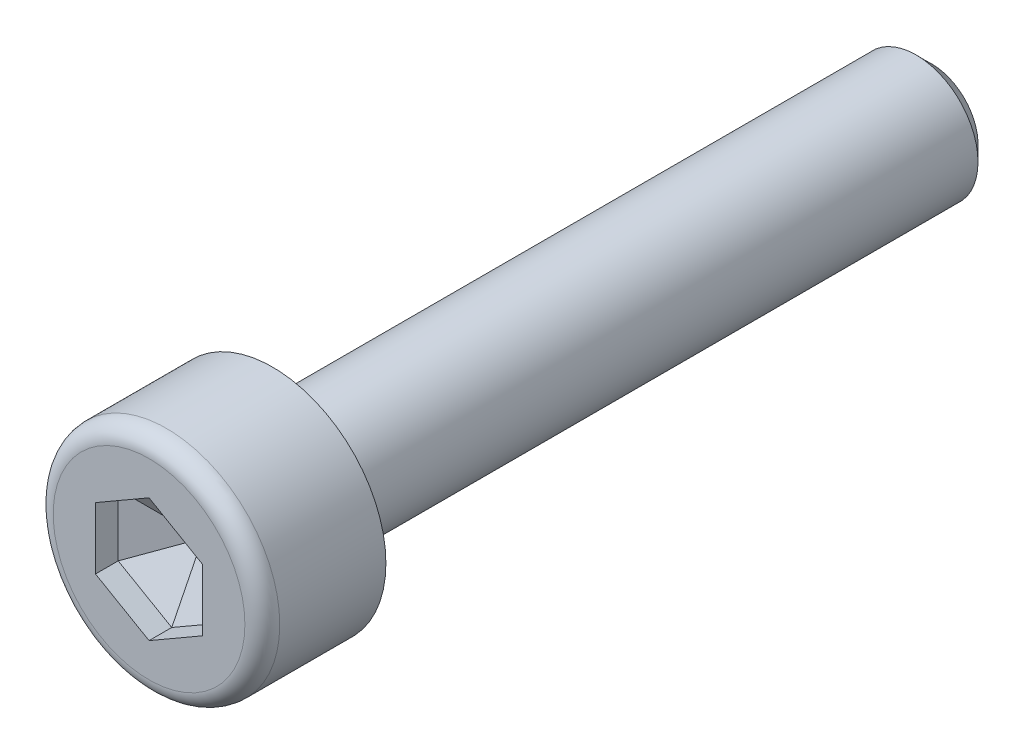
ISO-10303-21;
HEADER;
FILE_DESCRIPTION(('STEP AP214'),'2;1');
FILE_NAME('part.step','',(''),(''),'','','');
FILE_SCHEMA(('AUTOMOTIVE_DESIGN { 1 0 10303 214 1 1 1 1 }'));
ENDSEC;
DATA;
#1=APPLICATION_CONTEXT('core data for automotive mechanical design processes');
#2=APPLICATION_PROTOCOL_DEFINITION('international standard','automotive_design',2000,#1);
#3=PRODUCT_CONTEXT('',#1,'mechanical');
#4=PRODUCT('Part','Part','',(#3));
#5=PRODUCT_RELATED_PRODUCT_CATEGORY('part','',(#4));
#6=PRODUCT_DEFINITION_FORMATION('','',#4);
#7=PRODUCT_DEFINITION_CONTEXT('part definition',#1,'design');
#8=PRODUCT_DEFINITION('design','',#6,#7);
#9=PRODUCT_DEFINITION_SHAPE('','',#8);
#10=(LENGTH_UNIT() NAMED_UNIT(*) SI_UNIT(.MILLI.,.METRE.));
#11=(NAMED_UNIT(*) PLANE_ANGLE_UNIT() SI_UNIT($,.RADIAN.));
#12=(NAMED_UNIT(*) SI_UNIT($,.STERADIAN.) SOLID_ANGLE_UNIT());
#13=UNCERTAINTY_MEASURE_WITH_UNIT(LENGTH_MEASURE(1.E-05),#10,'distance_accuracy_value','');
#14=(GEOMETRIC_REPRESENTATION_CONTEXT(3) GLOBAL_UNCERTAINTY_ASSIGNED_CONTEXT((#13)) GLOBAL_UNIT_ASSIGNED_CONTEXT((#10,
#11,#12)) REPRESENTATION_CONTEXT('',''));
#15=CARTESIAN_POINT('',(0.,0.,0.));
#16=DIRECTION('',(0.,0.,1.));
#17=DIRECTION('',(1.,0.,0.));
#18=AXIS2_PLACEMENT_3D('',#15,#16,#17);
#19=CARTESIAN_POINT('',(0.,0.,0.));
#20=DIRECTION('',(0.,0.,1.));
#21=DIRECTION('',(1.,0.,0.));
#22=AXIS2_PLACEMENT_3D('',#19,#20,#21);
#23=PLANE('',#22);
#24=CARTESIAN_POINT('',(0.,0.,0.));
#25=DIRECTION('',(0.,0.,1.));
#26=DIRECTION('',(1.,0.,0.));
#27=AXIS2_PLACEMENT_3D('',#24,#25,#26);
#28=CIRCLE('',#27,1.6);
#29=CARTESIAN_POINT('',(1.6,0.,0.));
#30=VERTEX_POINT('',#29);
#31=EDGE_CURVE('E11',#30,#30,#28,.T.);
#32=ORIENTED_EDGE('',*,*,#31,.T.);
#33=EDGE_LOOP('',(#32));
#34=FACE_BOUND('',#33,.T.);
#35=CARTESIAN_POINT('',(0.,0.,0.));
#36=DIRECTION('',(0.,0.,1.));
#37=DIRECTION('',(1.,0.,0.));
#38=AXIS2_PLACEMENT_3D('',#35,#36,#37);
#39=CIRCLE('',#38,2.75);
#40=CARTESIAN_POINT('',(2.75,0.,0.));
#41=VERTEX_POINT('',#40);
#42=EDGE_CURVE('E154',#41,#41,#39,.T.);
#43=ORIENTED_EDGE('',*,*,#42,.F.);
#44=EDGE_LOOP('',(#43));
#45=FACE_BOUND('',#44,.T.);
#46=ADVANCED_FACE('F44',(#34,#45),#23,.F.);
#47=CARTESIAN_POINT('',(0.,0.,3.));
#48=DIRECTION('',(0.,0.,-1.));
#49=DIRECTION('',(-1.,0.,0.));
#50=AXIS2_PLACEMENT_3D('',#47,#48,#49);
#51=CYLINDRICAL_SURFACE('',#50,2.75);
#52=CARTESIAN_POINT('',(0.,0.,2.57692307692308));
#53=DIRECTION('',(0.,0.,1.));
#54=DIRECTION('',(1.,0.,0.));
#55=AXIS2_PLACEMENT_3D('',#52,#53,#54);
#56=CIRCLE('',#55,2.75);
#57=CARTESIAN_POINT('',(2.75,0.,2.57692307692308));
#58=VERTEX_POINT('',#57);
#59=EDGE_CURVE('E173',#58,#58,#56,.F.);
#60=ORIENTED_EDGE('',*,*,#59,.T.);
#61=EDGE_LOOP('',(#60));
#62=FACE_BOUND('',#61,.T.);
#63=ORIENTED_EDGE('',*,*,#42,.T.);
#64=EDGE_LOOP('',(#63));
#65=FACE_BOUND('',#64,.T.);
#66=ADVANCED_FACE('F235',(#62,#65),#51,.T.);
#67=CARTESIAN_POINT('',(0.,0.,3.));
#68=DIRECTION('',(0.,0.,1.));
#69=DIRECTION('',(1.,0.,0.));
#70=AXIS2_PLACEMENT_3D('',#67,#68,#69);
#71=PLANE('',#70);
#72=CARTESIAN_POINT('',(0.,0.,3.));
#73=DIRECTION('',(0.,0.,1.));
#74=DIRECTION('',(1.,0.,0.));
#75=AXIS2_PLACEMENT_3D('',#72,#73,#74);
#76=CIRCLE('',#75,2.32692307692308);
#77=CARTESIAN_POINT('',(2.32692307692308,0.,3.));
#78=VERTEX_POINT('',#77);
#79=EDGE_CURVE('E167',#78,#78,#76,.T.);
#80=ORIENTED_EDGE('',*,*,#79,.T.);
#81=EDGE_LOOP('',(#80));
#82=FACE_BOUND('',#81,.T.);
#83=DIRECTION('',(0.,1.,0.));
#84=VECTOR('',#83,1.);
#85=CARTESIAN_POINT('',(1.3,-0.750555349946514,3.));
#86=LINE('',#85,#84);
#87=CARTESIAN_POINT('',(1.3,-0.750555349946514,3.));
#88=VERTEX_POINT('',#87);
#89=CARTESIAN_POINT('',(1.3,0.750555349946514,3.));
#90=VERTEX_POINT('',#89);
#91=EDGE_CURVE('E140',#88,#90,#86,.T.);
#92=ORIENTED_EDGE('',*,*,#91,.F.);
#93=DIRECTION('',(0.866025403784439,0.5,0.));
#94=VECTOR('',#93,1.);
#95=CARTESIAN_POINT('',(0.,-1.50111069989303,3.));
#96=LINE('',#95,#94);
#97=CARTESIAN_POINT('',(0.,-1.50111069989303,3.));
#98=VERTEX_POINT('',#97);
#99=EDGE_CURVE('E149',#98,#88,#96,.T.);
#100=ORIENTED_EDGE('',*,*,#99,.F.);
#101=DIRECTION('',(0.866025403784439,-0.5,0.));
#102=VECTOR('',#101,1.);
#103=CARTESIAN_POINT('',(-1.3,-0.750555349946513,3.));
#104=LINE('',#103,#102);
#105=CARTESIAN_POINT('',(-1.3,-0.750555349946513,3.));
#106=VERTEX_POINT('',#105);
#107=EDGE_CURVE('E144',#106,#98,#104,.T.);
#108=ORIENTED_EDGE('',*,*,#107,.F.);
#109=DIRECTION('',(0.,-1.,0.));
#110=VECTOR('',#109,1.);
#111=CARTESIAN_POINT('',(-1.3,0.750555349946514,3.));
#112=LINE('',#111,#110);
#113=CARTESIAN_POINT('',(-1.3,0.750555349946514,3.));
#114=VERTEX_POINT('',#113);
#115=EDGE_CURVE('E145',#114,#106,#112,.T.);
#116=ORIENTED_EDGE('',*,*,#115,.F.);
#117=DIRECTION('',(-0.866025403784439,-0.5,0.));
#118=VECTOR('',#117,1.);
#119=CARTESIAN_POINT('',(0.,1.50111069989303,3.));
#120=LINE('',#119,#118);
#121=CARTESIAN_POINT('',(0.,1.50111069989303,3.));
#122=VERTEX_POINT('',#121);
#123=EDGE_CURVE('E125',#122,#114,#120,.T.);
#124=ORIENTED_EDGE('',*,*,#123,.F.);
#125=DIRECTION('',(-0.866025403784439,0.5,0.));
#126=VECTOR('',#125,1.);
#127=CARTESIAN_POINT('',(1.3,0.750555349946514,3.));
#128=LINE('',#127,#126);
#129=EDGE_CURVE('E135',#90,#122,#128,.T.);
#130=ORIENTED_EDGE('',*,*,#129,.F.);
#131=EDGE_LOOP('',(#92,#100,#108,#116,#124,#130));
#132=FACE_BOUND('',#131,.T.);
#133=ADVANCED_FACE('F137',(#82,#132),#71,.T.);
#134=CARTESIAN_POINT('',(1.3,-0.750555349946514,1.7));
#135=DIRECTION('',(1.,0.,0.));
#136=DIRECTION('',(0.,1.,0.));
#137=AXIS2_PLACEMENT_3D('',#134,#135,#136);
#138=PLANE('',#137);
#139=DIRECTION('',(0.,0.,1.));
#140=VECTOR('',#139,1.);
#141=CARTESIAN_POINT('',(1.3,0.750555349946514,1.7));
#142=LINE('',#141,#140);
#143=CARTESIAN_POINT('',(1.3,0.750555349946514,2.4492795389049));
#144=VERTEX_POINT('',#143);
#145=EDGE_CURVE('E127',#144,#90,#142,.T.);
#146=ORIENTED_EDGE('',*,*,#145,.F.);
#147=DIRECTION('',(0.,-1.,0.));
#148=VECTOR('',#147,1.);
#149=CARTESIAN_POINT('',(1.3,-0.750555349946514,2.4492795389049));
#150=LINE('',#149,#148);
#151=CARTESIAN_POINT('',(1.3,-0.750555349946514,2.4492795389049));
#152=VERTEX_POINT('',#151);
#153=EDGE_CURVE('E67',#144,#152,#150,.T.);
#154=ORIENTED_EDGE('',*,*,#153,.T.);
#155=DIRECTION('',(0.,0.,1.));
#156=VECTOR('',#155,1.);
#157=CARTESIAN_POINT('',(1.3,-0.750555349946514,1.7));
#158=LINE('',#157,#156);
#159=EDGE_CURVE('E152',#152,#88,#158,.T.);
#160=ORIENTED_EDGE('',*,*,#159,.T.);
#161=ORIENTED_EDGE('',*,*,#91,.T.);
#162=EDGE_LOOP('',(#146,#154,#160,#161));
#163=FACE_BOUND('',#162,.T.);
#164=ADVANCED_FACE('F292',(#163),#138,.F.);
#165=CARTESIAN_POINT('',(0.,-1.50111069989303,1.7));
#166=DIRECTION('',(0.5,-0.866025403784439,0.));
#167=DIRECTION('',(0.866025403784439,0.5,0.));
#168=AXIS2_PLACEMENT_3D('',#165,#166,#167);
#169=PLANE('',#168);
#170=ORIENTED_EDGE('',*,*,#159,.F.);
#171=DIRECTION('',(-0.866025403784439,-0.5,0.));
#172=VECTOR('',#171,1.);
#173=CARTESIAN_POINT('',(0.,-1.50111069989303,2.4492795389049));
#174=LINE('',#173,#172);
#175=CARTESIAN_POINT('',(0.,-1.50111069989303,2.4492795389049));
#176=VERTEX_POINT('',#175);
#177=EDGE_CURVE('E58',#152,#176,#174,.T.);
#178=ORIENTED_EDGE('',*,*,#177,.T.);
#179=DIRECTION('',(0.,0.,1.));
#180=VECTOR('',#179,1.);
#181=CARTESIAN_POINT('',(0.,-1.50111069989303,1.7));
#182=LINE('',#181,#180);
#183=EDGE_CURVE('E156',#176,#98,#182,.T.);
#184=ORIENTED_EDGE('',*,*,#183,.T.);
#185=ORIENTED_EDGE('',*,*,#99,.T.);
#186=EDGE_LOOP('',(#170,#178,#184,#185));
#187=FACE_BOUND('',#186,.T.);
#188=ADVANCED_FACE('F295',(#187),#169,.F.);
#189=CARTESIAN_POINT('',(-1.3,-0.750555349946513,1.7));
#190=DIRECTION('',(-0.5,-0.866025403784439,0.));
#191=DIRECTION('',(0.866025403784439,-0.5,0.));
#192=AXIS2_PLACEMENT_3D('',#189,#190,#191);
#193=PLANE('',#192);
#194=ORIENTED_EDGE('',*,*,#183,.F.);
#195=DIRECTION('',(-0.866025403784439,0.5,0.));
#196=VECTOR('',#195,1.);
#197=CARTESIAN_POINT('',(-1.3,-0.750555349946513,2.4492795389049));
#198=LINE('',#197,#196);
#199=CARTESIAN_POINT('',(-1.3,-0.750555349946513,2.4492795389049));
#200=VERTEX_POINT('',#199);
#201=EDGE_CURVE('E196',#176,#200,#198,.T.);
#202=ORIENTED_EDGE('',*,*,#201,.T.);
#203=DIRECTION('',(0.,0.,1.));
#204=VECTOR('',#203,1.);
#205=CARTESIAN_POINT('',(-1.3,-0.750555349946513,1.7));
#206=LINE('',#205,#204);
#207=EDGE_CURVE('E158',#200,#106,#206,.T.);
#208=ORIENTED_EDGE('',*,*,#207,.T.);
#209=ORIENTED_EDGE('',*,*,#107,.T.);
#210=EDGE_LOOP('',(#194,#202,#208,#209));
#211=FACE_BOUND('',#210,.T.);
#212=ADVANCED_FACE('F282',(#211),#193,.F.);
#213=CARTESIAN_POINT('',(-1.3,0.750555349946514,1.7));
#214=DIRECTION('',(-1.,0.,0.));
#215=DIRECTION('',(0.,0.,1.));
#216=AXIS2_PLACEMENT_3D('',#213,#214,#215);
#217=PLANE('',#216);
#218=ORIENTED_EDGE('',*,*,#207,.F.);
#219=DIRECTION('',(0.,1.,0.));
#220=VECTOR('',#219,1.);
#221=CARTESIAN_POINT('',(-1.3,0.750555349946514,2.4492795389049));
#222=LINE('',#221,#220);
#223=CARTESIAN_POINT('',(-1.3,0.750555349946514,2.4492795389049));
#224=VERTEX_POINT('',#223);
#225=EDGE_CURVE('E186',#200,#224,#222,.T.);
#226=ORIENTED_EDGE('',*,*,#225,.T.);
#227=DIRECTION('',(0.,0.,1.));
#228=VECTOR('',#227,1.);
#229=CARTESIAN_POINT('',(-1.3,0.750555349946514,1.7));
#230=LINE('',#229,#228);
#231=EDGE_CURVE('E126',#224,#114,#230,.T.);
#232=ORIENTED_EDGE('',*,*,#231,.T.);
#233=ORIENTED_EDGE('',*,*,#115,.T.);
#234=EDGE_LOOP('',(#218,#226,#232,#233));
#235=FACE_BOUND('',#234,.T.);
#236=ADVANCED_FACE('F286',(#235),#217,.F.);
#237=CARTESIAN_POINT('',(0.,1.50111069989303,1.7));
#238=DIRECTION('',(-0.5,0.866025403784439,0.));
#239=DIRECTION('',(-0.866025403784439,-0.5,0.));
#240=AXIS2_PLACEMENT_3D('',#237,#238,#239);
#241=PLANE('',#240);
#242=ORIENTED_EDGE('',*,*,#231,.F.);
#243=DIRECTION('',(0.866025403784439,0.5,0.));
#244=VECTOR('',#243,1.);
#245=CARTESIAN_POINT('',(0.,1.50111069989303,2.4492795389049));
#246=LINE('',#245,#244);
#247=CARTESIAN_POINT('',(0.,1.50111069989303,2.4492795389049));
#248=VERTEX_POINT('',#247);
#249=EDGE_CURVE('E123',#224,#248,#246,.T.);
#250=ORIENTED_EDGE('',*,*,#249,.T.);
#251=DIRECTION('',(0.,0.,1.));
#252=VECTOR('',#251,1.);
#253=CARTESIAN_POINT('',(0.,1.50111069989303,1.7));
#254=LINE('',#253,#252);
#255=EDGE_CURVE('E120',#248,#122,#254,.T.);
#256=ORIENTED_EDGE('',*,*,#255,.T.);
#257=ORIENTED_EDGE('',*,*,#123,.T.);
#258=EDGE_LOOP('',(#242,#250,#256,#257));
#259=FACE_BOUND('',#258,.T.);
#260=ADVANCED_FACE('F119',(#259),#241,.F.);
#261=CARTESIAN_POINT('',(1.3,0.750555349946514,1.7));
#262=DIRECTION('',(0.5,0.866025403784439,0.));
#263=DIRECTION('',(-0.866025403784439,0.5,0.));
#264=AXIS2_PLACEMENT_3D('',#261,#262,#263);
#265=PLANE('',#264);
#266=ORIENTED_EDGE('',*,*,#255,.F.);
#267=DIRECTION('',(0.866025403784439,-0.5,0.));
#268=VECTOR('',#267,1.);
#269=CARTESIAN_POINT('',(1.3,0.750555349946514,2.4492795389049));
#270=LINE('',#269,#268);
#271=EDGE_CURVE('E191',#248,#144,#270,.T.);
#272=ORIENTED_EDGE('',*,*,#271,.T.);
#273=ORIENTED_EDGE('',*,*,#145,.T.);
#274=ORIENTED_EDGE('',*,*,#129,.T.);
#275=EDGE_LOOP('',(#266,#272,#273,#274));
#276=FACE_BOUND('',#275,.T.);
#277=ADVANCED_FACE('F132',(#276),#265,.F.);
#278=CARTESIAN_POINT('',(0.,0.,1.7));
#279=DIRECTION('',(0.,0.,1.));
#280=DIRECTION('',(1.,0.,0.));
#281=AXIS2_PLACEMENT_3D('',#278,#279,#280);
#282=PLANE('',#281);
#283=DIRECTION('',(-0.866025403784439,-0.5,0.));
#284=VECTOR('',#283,1.);
#285=CARTESIAN_POINT('',(-0.00110488477245908,0.00191371656240831,1.7));
#286=LINE('',#285,#284);
#287=CARTESIAN_POINT('',(0.,0.00255162208321077,1.7));
#288=VERTEX_POINT('',#287);
#289=CARTESIAN_POINT('',(-0.00220976954491822,0.00127581104160551,1.7));
#290=VERTEX_POINT('',#289);
#291=EDGE_CURVE('E183',#288,#290,#286,.T.);
#292=ORIENTED_EDGE('',*,*,#291,.T.);
#293=DIRECTION('',(0.,-1.,0.));
#294=VECTOR('',#293,1.);
#295=CARTESIAN_POINT('',(-0.00220976954491822,0.,1.7));
#296=LINE('',#295,#294);
#297=CARTESIAN_POINT('',(-0.00220976954491822,-0.00127581104160539,1.7));
#298=VERTEX_POINT('',#297);
#299=EDGE_CURVE('E187',#290,#298,#296,.T.);
#300=ORIENTED_EDGE('',*,*,#299,.T.);
#301=DIRECTION('',(0.866025403784439,-0.5,0.));
#302=VECTOR('',#301,1.);
#303=CARTESIAN_POINT('',(-0.00110488477245903,-0.00191371656240821,1.7));
#304=LINE('',#303,#302);
#305=CARTESIAN_POINT('',(0.,-0.00255162208321082,1.7));
#306=VERTEX_POINT('',#305);
#307=EDGE_CURVE('E178',#298,#306,#304,.T.);
#308=ORIENTED_EDGE('',*,*,#307,.T.);
#309=DIRECTION('',(0.866025403784439,0.5,0.));
#310=VECTOR('',#309,1.);
#311=CARTESIAN_POINT('',(0.00110488477245889,-0.00191371656240798,1.7));
#312=LINE('',#311,#310);
#313=CARTESIAN_POINT('',(0.00220976954491811,-0.0012758110416051,1.7));
#314=VERTEX_POINT('',#313);
#315=EDGE_CURVE('E176',#306,#314,#312,.T.);
#316=ORIENTED_EDGE('',*,*,#315,.T.);
#317=DIRECTION('',(0.,1.,0.));
#318=VECTOR('',#317,1.);
#319=CARTESIAN_POINT('',(0.00220976954491811,0.,1.7));
#320=LINE('',#319,#318);
#321=CARTESIAN_POINT('',(0.00220976954491811,0.00127581104160497,1.7));
#322=VERTEX_POINT('',#321);
#323=EDGE_CURVE('E179',#314,#322,#320,.T.);
#324=ORIENTED_EDGE('',*,*,#323,.T.);
#325=DIRECTION('',(-0.866025403784439,0.5,0.));
#326=VECTOR('',#325,1.);
#327=CARTESIAN_POINT('',(0.00110488477245884,0.00191371656240789,1.7));
#328=LINE('',#327,#326);
#329=EDGE_CURVE('E185',#322,#288,#328,.T.);
#330=ORIENTED_EDGE('',*,*,#329,.T.);
#331=EDGE_LOOP('',(#292,#300,#308,#316,#324,#330));
#332=FACE_BOUND('',#331,.T.);
#333=ADVANCED_FACE('F303',(#332),#282,.T.);
#334=CARTESIAN_POINT('',(0.,0.,-16.));
#335=DIRECTION('',(0.,0.,1.));
#336=DIRECTION('',(1.,0.,0.));
#337=AXIS2_PLACEMENT_3D('',#334,#335,#336);
#338=CYLINDRICAL_SURFACE('',#337,1.5);
#339=CARTESIAN_POINT('',(0.,0.,-0.0999999999999994));
#340=DIRECTION('',(0.,0.,1.));
#341=DIRECTION('',(1.,0.,0.));
#342=AXIS2_PLACEMENT_3D('',#339,#340,#341);
#343=CIRCLE('',#342,1.5);
#344=CARTESIAN_POINT('',(1.5,0.,-0.0999999999999994));
#345=VERTEX_POINT('',#344);
#346=EDGE_CURVE('E52',#345,#345,#343,.F.);
#347=ORIENTED_EDGE('',*,*,#346,.T.);
#348=EDGE_LOOP('',(#347));
#349=FACE_BOUND('',#348,.T.);
#350=CARTESIAN_POINT('',(0.,0.,-15.625));
#351=DIRECTION('',(0.,0.,-1.));
#352=DIRECTION('',(-1.,0.,0.));
#353=AXIS2_PLACEMENT_3D('',#350,#351,#352);
#354=CIRCLE('',#353,1.5);
#355=CARTESIAN_POINT('',(-1.5,0.,-15.625));
#356=VERTEX_POINT('',#355);
#357=EDGE_CURVE('E170',#356,#356,#354,.F.);
#358=ORIENTED_EDGE('',*,*,#357,.T.);
#359=EDGE_LOOP('',(#358));
#360=FACE_BOUND('',#359,.T.);
#361=ADVANCED_FACE('F220',(#349,#360),#338,.T.);
#362=CARTESIAN_POINT('',(0.,0.,-16.));
#363=DIRECTION('',(0.,0.,-1.));
#364=DIRECTION('',(-1.,0.,0.));
#365=AXIS2_PLACEMENT_3D('',#362,#363,#364);
#366=PLANE('',#365);
#367=CARTESIAN_POINT('',(0.,0.,-16.));
#368=DIRECTION('',(0.,0.,-1.));
#369=DIRECTION('',(-1.,0.,0.));
#370=AXIS2_PLACEMENT_3D('',#367,#368,#369);
#371=CIRCLE('',#370,1.125);
#372=CARTESIAN_POINT('',(-1.125,0.,-16.));
#373=VERTEX_POINT('',#372);
#374=EDGE_CURVE('E165',#373,#373,#371,.T.);
#375=ORIENTED_EDGE('',*,*,#374,.T.);
#376=EDGE_LOOP('',(#375));
#377=FACE_BOUND('',#376,.T.);
#378=ADVANCED_FACE('F247',(#377),#366,.T.);
#379=CARTESIAN_POINT('',(0.,0.,-16.));
#380=DIRECTION('',(0.,0.,1.));
#381=DIRECTION('',(1.,0.,0.));
#382=AXIS2_PLACEMENT_3D('',#379,#380,#381);
#383=CONICAL_SURFACE('',#382,1.125,0.785398163397447);
#384=ORIENTED_EDGE('',*,*,#357,.F.);
#385=EDGE_LOOP('',(#384));
#386=FACE_BOUND('',#385,.T.);
#387=ORIENTED_EDGE('',*,*,#374,.F.);
#388=EDGE_LOOP('',(#387));
#389=FACE_BOUND('',#388,.T.);
#390=ADVANCED_FACE('F242',(#386,#389),#383,.T.);
#391=CARTESIAN_POINT('',(0.,0.,2.57692307692308));
#392=DIRECTION('',(0.,0.,1.));
#393=DIRECTION('',(1.,0.,0.));
#394=AXIS2_PLACEMENT_3D('',#391,#392,#393);
#395=TOROIDAL_SURFACE('',#394,2.32692307692308,0.423076923076923);
#396=ORIENTED_EDGE('',*,*,#59,.F.);
#397=EDGE_LOOP('',(#396));
#398=FACE_BOUND('',#397,.T.);
#399=ORIENTED_EDGE('',*,*,#79,.F.);
#400=EDGE_LOOP('',(#399));
#401=FACE_BOUND('',#400,.T.);
#402=ADVANCED_FACE('F250',(#398,#401),#395,.T.);
#403=CARTESIAN_POINT('',(0.00220976954491811,0.,1.7));
#404=DIRECTION('',(0.499999999999995,0.,-0.866025403784441));
#405=DIRECTION('',(0.,1.,0.));
#406=AXIS2_PLACEMENT_3D('',#403,#404,#405);
#407=PLANE('',#406);
#408=DIRECTION('',(-0.774596669241485,0.447213595499959,-0.447213595499953));
#409=VECTOR('',#408,1.);
#410=CARTESIAN_POINT('',(0.00176781563593457,-0.0010206488332842,1.69974483779168));
#411=LINE('',#410,#409);
#412=EDGE_CURVE('E209',#152,#314,#411,.T.);
#413=ORIENTED_EDGE('',*,*,#412,.F.);
#414=ORIENTED_EDGE('',*,*,#153,.F.);
#415=DIRECTION('',(-0.774596669241485,-0.447213595499959,-0.447213595499953));
#416=VECTOR('',#415,1.);
#417=CARTESIAN_POINT('',(0.0017678156359344,0.00102064883328385,1.69974483779168));
#418=LINE('',#417,#416);
#419=EDGE_CURVE('E215',#322,#144,#418,.F.);
#420=ORIENTED_EDGE('',*,*,#419,.F.);
#421=ORIENTED_EDGE('',*,*,#323,.F.);
#422=EDGE_LOOP('',(#413,#414,#420,#421));
#423=FACE_BOUND('',#422,.T.);
#424=ADVANCED_FACE('F252',(#423),#407,.F.);
#425=CARTESIAN_POINT('',(0.00110488477245884,0.00191371656240789,1.7));
#426=DIRECTION('',(0.249999999999997,0.433012701892215,-0.866025403784441));
#427=DIRECTION('',(-0.866025403784439,0.5,0.));
#428=AXIS2_PLACEMENT_3D('',#425,#426,#427);
#429=PLANE('',#428);
#430=ORIENTED_EDGE('',*,*,#419,.T.);
#431=ORIENTED_EDGE('',*,*,#271,.F.);
#432=DIRECTION('',(0.,-0.894427190999918,-0.447213595499953));
#433=VECTOR('',#432,1.);
#434=CARTESIAN_POINT('',(0.,0.0020412976665688,1.69974483779168));
#435=LINE('',#434,#433);
#436=EDGE_CURVE('E207',#288,#248,#435,.F.);
#437=ORIENTED_EDGE('',*,*,#436,.F.);
#438=ORIENTED_EDGE('',*,*,#329,.F.);
#439=EDGE_LOOP('',(#430,#431,#437,#438));
#440=FACE_BOUND('',#439,.T.);
#441=ADVANCED_FACE('F263',(#440),#429,.F.);
#442=CARTESIAN_POINT('',(0.00110488477245895,-0.00191371656240807,1.7));
#443=DIRECTION('',(0.249999999999997,-0.433012701892215,-0.866025403784441));
#444=DIRECTION('',(0.866025403784439,0.5,0.));
#445=AXIS2_PLACEMENT_3D('',#442,#443,#444);
#446=PLANE('',#445);
#447=ORIENTED_EDGE('',*,*,#412,.T.);
#448=ORIENTED_EDGE('',*,*,#315,.F.);
#449=DIRECTION('',(0.,-0.894427190999918,0.447213595499953));
#450=VECTOR('',#449,1.);
#451=CARTESIAN_POINT('',(0.,-0.00204129766656878,1.69974483779168));
#452=LINE('',#451,#450);
#453=EDGE_CURVE('E203',#176,#306,#452,.F.);
#454=ORIENTED_EDGE('',*,*,#453,.F.);
#455=ORIENTED_EDGE('',*,*,#177,.F.);
#456=EDGE_LOOP('',(#447,#448,#454,#455));
#457=FACE_BOUND('',#456,.T.);
#458=ADVANCED_FACE('F259',(#457),#446,.F.);
#459=CARTESIAN_POINT('',(-0.00110488477245908,0.00191371656240831,1.7));
#460=DIRECTION('',(-0.249999999999997,0.433012701892215,-0.866025403784441));
#461=DIRECTION('',(-0.866025403784439,-0.5,0.));
#462=AXIS2_PLACEMENT_3D('',#459,#460,#461);
#463=PLANE('',#462);
#464=ORIENTED_EDGE('',*,*,#436,.T.);
#465=ORIENTED_EDGE('',*,*,#249,.F.);
#466=DIRECTION('',(0.774596669241485,-0.447213595499959,-0.447213595499953));
#467=VECTOR('',#466,1.);
#468=CARTESIAN_POINT('',(-0.00176781563593459,0.00102064883328441,1.69974483779168));
#469=LINE('',#468,#467);
#470=EDGE_CURVE('E201',#290,#224,#469,.F.);
#471=ORIENTED_EDGE('',*,*,#470,.F.);
#472=ORIENTED_EDGE('',*,*,#291,.F.);
#473=EDGE_LOOP('',(#464,#465,#471,#472));
#474=FACE_BOUND('',#473,.T.);
#475=ADVANCED_FACE('F258',(#474),#463,.F.);
#476=CARTESIAN_POINT('',(-0.00110488477245906,-0.00191371656240826,1.7));
#477=DIRECTION('',(-0.249999999999998,-0.433012701892215,-0.866025403784441));
#478=DIRECTION('',(0.866025403784439,-0.5,0.));
#479=AXIS2_PLACEMENT_3D('',#476,#477,#478);
#480=PLANE('',#479);
#481=ORIENTED_EDGE('',*,*,#453,.T.);
#482=ORIENTED_EDGE('',*,*,#307,.F.);
#483=DIRECTION('',(-0.774596669241485,-0.447213595499959,0.447213595499953));
#484=VECTOR('',#483,1.);
#485=CARTESIAN_POINT('',(-0.00176781563593462,-0.00102064883328435,1.69974483779168));
#486=LINE('',#485,#484);
#487=EDGE_CURVE('E198',#200,#298,#486,.F.);
#488=ORIENTED_EDGE('',*,*,#487,.F.);
#489=ORIENTED_EDGE('',*,*,#201,.F.);
#490=EDGE_LOOP('',(#481,#482,#488,#489));
#491=FACE_BOUND('',#490,.T.);
#492=ADVANCED_FACE('F227',(#491),#480,.F.);
#493=CARTESIAN_POINT('',(-0.00220976954491822,0.,1.7));
#494=DIRECTION('',(-0.499999999999995,0.,-0.866025403784441));
#495=DIRECTION('',(0.,-1.,0.));
#496=AXIS2_PLACEMENT_3D('',#493,#494,#495);
#497=PLANE('',#496);
#498=ORIENTED_EDGE('',*,*,#470,.T.);
#499=ORIENTED_EDGE('',*,*,#225,.F.);
#500=ORIENTED_EDGE('',*,*,#487,.T.);
#501=ORIENTED_EDGE('',*,*,#299,.F.);
#502=EDGE_LOOP('',(#498,#499,#500,#501));
#503=FACE_BOUND('',#502,.T.);
#504=ADVANCED_FACE('F221',(#503),#497,.F.);
#505=CARTESIAN_POINT('',(0.,0.,-0.0999999999999994));
#506=DIRECTION('',(0.,0.,1.));
#507=DIRECTION('',(1.,0.,0.));
#508=AXIS2_PLACEMENT_3D('',#505,#506,#507);
#509=TOROIDAL_SURFACE('',#508,1.6,0.1);
#510=ORIENTED_EDGE('',*,*,#31,.F.);
#511=EDGE_LOOP('',(#510));
#512=FACE_BOUND('',#511,.T.);
#513=ORIENTED_EDGE('',*,*,#346,.F.);
#514=EDGE_LOOP('',(#513));
#515=FACE_BOUND('',#514,.T.);
#516=ADVANCED_FACE('F50',(#512,#515),#509,.F.);
#517=CLOSED_SHELL('',(#46,#66,#133,#164,#188,#212,#236,#260,#277,#333,#361,#378,#390,#402,#424,
#441,#458,#475,#492,#504,#516));
#518=MANIFOLD_SOLID_BREP('B2',#517);
#519=ADVANCED_BREP_SHAPE_REPRESENTATION('',(#18,#518),#14);
#520=SHAPE_DEFINITION_REPRESENTATION(#9,#519);
ENDSEC;
END-ISO-10303-21;
